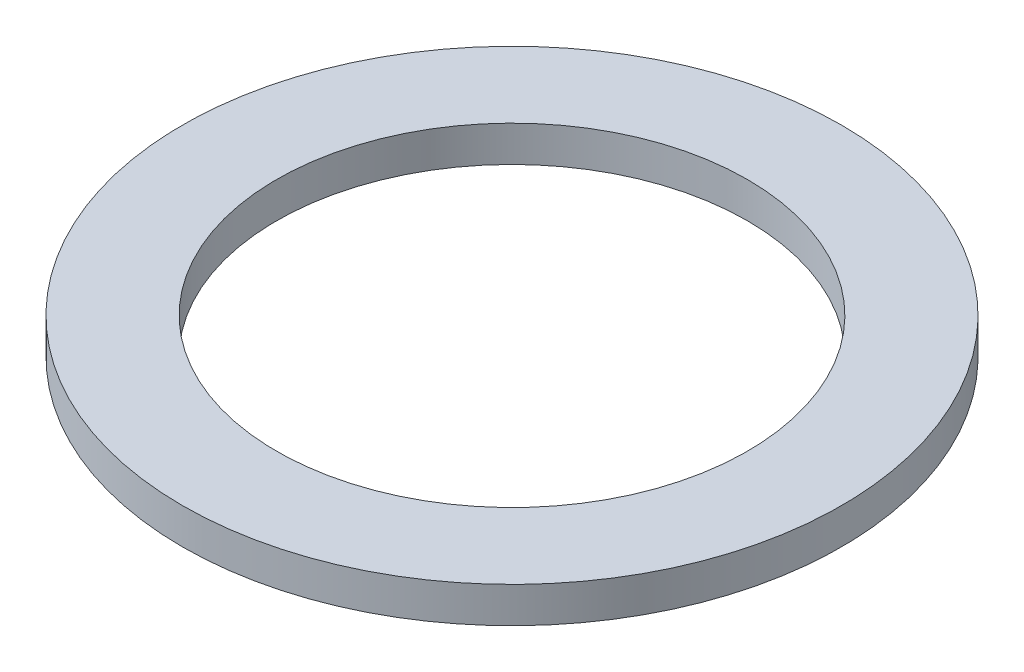
ISO-10303-21;
HEADER;
FILE_DESCRIPTION(('STEP AP214'),'2;1');
FILE_NAME('part.step','',(''),(''),'','','');
FILE_SCHEMA(('AUTOMOTIVE_DESIGN { 1 0 10303 214 1 1 1 1 }'));
ENDSEC;
DATA;
#1=APPLICATION_CONTEXT('core data for automotive mechanical design processes');
#2=APPLICATION_PROTOCOL_DEFINITION('international standard','automotive_design',2000,#1);
#3=PRODUCT_CONTEXT('',#1,'mechanical');
#4=PRODUCT('Part','Part','',(#3));
#5=PRODUCT_RELATED_PRODUCT_CATEGORY('part','',(#4));
#6=PRODUCT_DEFINITION_FORMATION('','',#4);
#7=PRODUCT_DEFINITION_CONTEXT('part definition',#1,'design');
#8=PRODUCT_DEFINITION('design','',#6,#7);
#9=PRODUCT_DEFINITION_SHAPE('','',#8);
#10=(LENGTH_UNIT() NAMED_UNIT(*) SI_UNIT(.MILLI.,.METRE.));
#11=(NAMED_UNIT(*) PLANE_ANGLE_UNIT() SI_UNIT($,.RADIAN.));
#12=(NAMED_UNIT(*) SI_UNIT($,.STERADIAN.) SOLID_ANGLE_UNIT());
#13=UNCERTAINTY_MEASURE_WITH_UNIT(LENGTH_MEASURE(1.E-05),#10,'distance_accuracy_value','');
#14=(GEOMETRIC_REPRESENTATION_CONTEXT(3) GLOBAL_UNCERTAINTY_ASSIGNED_CONTEXT((#13)) GLOBAL_UNIT_ASSIGNED_CONTEXT((#10,
#11,#12)) REPRESENTATION_CONTEXT('',''));
#15=CARTESIAN_POINT('',(0.,0.,0.));
#16=DIRECTION('',(0.,0.,1.));
#17=DIRECTION('',(1.,0.,0.));
#18=AXIS2_PLACEMENT_3D('',#15,#16,#17);
#19=CARTESIAN_POINT('',(0.,0.9652,0.));
#20=DIRECTION('',(0.,1.,0.));
#21=DIRECTION('',(0.,0.,1.));
#22=AXIS2_PLACEMENT_3D('',#19,#20,#21);
#23=PLANE('',#22);
#24=CARTESIAN_POINT('',(0.,0.9652,0.));
#25=DIRECTION('',(0.,1.,0.));
#26=DIRECTION('',(0.,0.,1.));
#27=AXIS2_PLACEMENT_3D('',#24,#25,#26);
#28=CIRCLE('',#27,8.89);
#29=CARTESIAN_POINT('',(0.,0.9652,-8.89));
#30=VERTEX_POINT('',#29);
#31=EDGE_CURVE('E10',#30,#30,#28,.T.);
#32=ORIENTED_EDGE('',*,*,#31,.T.);
#33=EDGE_LOOP('',(#32));
#34=FACE_BOUND('',#33,.T.);
#35=CARTESIAN_POINT('',(0.,0.9652,0.));
#36=DIRECTION('',(0.,1.,0.));
#37=DIRECTION('',(0.,0.,1.));
#38=AXIS2_PLACEMENT_3D('',#35,#36,#37);
#39=CIRCLE('',#38,6.35);
#40=CARTESIAN_POINT('',(0.,0.9652,-6.35));
#41=VERTEX_POINT('',#40);
#42=EDGE_CURVE('E46',#41,#41,#39,.T.);
#43=ORIENTED_EDGE('',*,*,#42,.F.);
#44=EDGE_LOOP('',(#43));
#45=FACE_BOUND('',#44,.T.);
#46=ADVANCED_FACE('F35',(#34,#45),#23,.T.);
#47=CARTESIAN_POINT('',(0.,0.,0.));
#48=DIRECTION('',(0.,1.,0.));
#49=DIRECTION('',(0.,0.,1.));
#50=AXIS2_PLACEMENT_3D('',#47,#48,#49);
#51=PLANE('',#50);
#52=CARTESIAN_POINT('',(0.,0.,0.));
#53=DIRECTION('',(0.,1.,0.));
#54=DIRECTION('',(0.,0.,1.));
#55=AXIS2_PLACEMENT_3D('',#52,#53,#54);
#56=CIRCLE('',#55,8.89);
#57=CARTESIAN_POINT('',(0.,0.,-8.89));
#58=VERTEX_POINT('',#57);
#59=EDGE_CURVE('E39',#58,#58,#56,.T.);
#60=ORIENTED_EDGE('',*,*,#59,.F.);
#61=EDGE_LOOP('',(#60));
#62=FACE_BOUND('',#61,.T.);
#63=CARTESIAN_POINT('',(0.,0.,0.));
#64=DIRECTION('',(0.,1.,0.));
#65=DIRECTION('',(0.,0.,1.));
#66=AXIS2_PLACEMENT_3D('',#63,#64,#65);
#67=CIRCLE('',#66,6.35);
#68=CARTESIAN_POINT('',(0.,0.,-6.35));
#69=VERTEX_POINT('',#68);
#70=EDGE_CURVE('E48',#69,#69,#67,.T.);
#71=ORIENTED_EDGE('',*,*,#70,.T.);
#72=EDGE_LOOP('',(#71));
#73=FACE_BOUND('',#72,.T.);
#74=ADVANCED_FACE('F58',(#62,#73),#51,.F.);
#75=CARTESIAN_POINT('',(0.,0.9652,0.));
#76=DIRECTION('',(0.,-1.,0.));
#77=DIRECTION('',(0.,0.,-1.));
#78=AXIS2_PLACEMENT_3D('',#75,#76,#77);
#79=CYLINDRICAL_SURFACE('',#78,8.89);
#80=CARTESIAN_POINT('',(0.,0.9652,-8.89));
#81=CARTESIAN_POINT('',(0.,0.955145833333333,-8.89));
#82=CARTESIAN_POINT('',(0.,0.945091666666667,-8.89));
#83=CARTESIAN_POINT('',(0.,0.924983333333333,-8.89));
#84=CARTESIAN_POINT('',(0.,0.914929166666667,-8.89));
#85=CARTESIAN_POINT('',(0.,0.894820833333333,-8.89));
#86=CARTESIAN_POINT('',(0.,0.884766666666667,-8.89));
#87=CARTESIAN_POINT('',(0.,0.864658333333333,-8.89));
#88=CARTESIAN_POINT('',(0.,0.854604166666667,-8.89));
#89=CARTESIAN_POINT('',(0.,0.834495833333333,-8.89));
#90=CARTESIAN_POINT('',(0.,0.824441666666667,-8.89));
#91=CARTESIAN_POINT('',(0.,0.804333333333333,-8.89));
#92=CARTESIAN_POINT('',(0.,0.794279166666667,-8.89));
#93=CARTESIAN_POINT('',(0.,0.774170833333333,-8.89));
#94=CARTESIAN_POINT('',(0.,0.764116666666667,-8.89));
#95=CARTESIAN_POINT('',(0.,0.744008333333333,-8.89));
#96=CARTESIAN_POINT('',(0.,0.733954166666667,-8.89));
#97=CARTESIAN_POINT('',(0.,0.713845833333333,-8.89));
#98=CARTESIAN_POINT('',(0.,0.703791666666667,-8.89));
#99=CARTESIAN_POINT('',(0.,0.683683333333333,-8.89));
#100=CARTESIAN_POINT('',(0.,0.673629166666667,-8.89));
#101=CARTESIAN_POINT('',(0.,0.653520833333333,-8.89));
#102=CARTESIAN_POINT('',(0.,0.643466666666667,-8.89));
#103=CARTESIAN_POINT('',(0.,0.623358333333333,-8.89));
#104=CARTESIAN_POINT('',(0.,0.613304166666667,-8.89));
#105=CARTESIAN_POINT('',(0.,0.593195833333333,-8.89));
#106=CARTESIAN_POINT('',(0.,0.583141666666667,-8.89));
#107=CARTESIAN_POINT('',(0.,0.563033333333333,-8.89));
#108=CARTESIAN_POINT('',(0.,0.552979166666667,-8.89));
#109=CARTESIAN_POINT('',(0.,0.532870833333333,-8.89));
#110=CARTESIAN_POINT('',(0.,0.522816666666667,-8.89));
#111=CARTESIAN_POINT('',(0.,0.502708333333333,-8.89));
#112=CARTESIAN_POINT('',(0.,0.492654166666667,-8.89));
#113=CARTESIAN_POINT('',(0.,0.472545833333333,-8.89));
#114=CARTESIAN_POINT('',(0.,0.462491666666667,-8.89));
#115=CARTESIAN_POINT('',(0.,0.442383333333333,-8.89));
#116=CARTESIAN_POINT('',(0.,0.432329166666667,-8.89));
#117=CARTESIAN_POINT('',(0.,0.412220833333333,-8.89));
#118=CARTESIAN_POINT('',(0.,0.402166666666667,-8.89));
#119=CARTESIAN_POINT('',(0.,0.382058333333333,-8.89));
#120=CARTESIAN_POINT('',(0.,0.372004166666667,-8.89));
#121=CARTESIAN_POINT('',(0.,0.351895833333333,-8.89));
#122=CARTESIAN_POINT('',(0.,0.341841666666667,-8.89));
#123=CARTESIAN_POINT('',(0.,0.321733333333333,-8.89));
#124=CARTESIAN_POINT('',(0.,0.311679166666667,-8.89));
#125=CARTESIAN_POINT('',(0.,0.291570833333333,-8.89));
#126=CARTESIAN_POINT('',(0.,0.281516666666667,-8.89));
#127=CARTESIAN_POINT('',(0.,0.261408333333333,-8.89));
#128=CARTESIAN_POINT('',(0.,0.251354166666667,-8.89));
#129=CARTESIAN_POINT('',(0.,0.231245833333333,-8.89));
#130=CARTESIAN_POINT('',(0.,0.221191666666667,-8.89));
#131=CARTESIAN_POINT('',(0.,0.201083333333333,-8.89));
#132=CARTESIAN_POINT('',(0.,0.191029166666667,-8.89));
#133=CARTESIAN_POINT('',(0.,0.170920833333333,-8.89));
#134=CARTESIAN_POINT('',(0.,0.160866666666667,-8.89));
#135=CARTESIAN_POINT('',(0.,0.140758333333333,-8.89));
#136=CARTESIAN_POINT('',(0.,0.130704166666667,-8.89));
#137=CARTESIAN_POINT('',(0.,0.110595833333333,-8.89));
#138=CARTESIAN_POINT('',(0.,0.100541666666667,-8.89));
#139=CARTESIAN_POINT('',(0.,0.0804333333333334,-8.89));
#140=CARTESIAN_POINT('',(0.,0.0703791666666667,-8.89));
#141=CARTESIAN_POINT('',(0.,0.0502708333333333,-8.89));
#142=CARTESIAN_POINT('',(0.,0.0402166666666666,-8.89));
#143=CARTESIAN_POINT('',(0.,0.0201083333333333,-8.89));
#144=CARTESIAN_POINT('',(0.,0.0100541666666667,-8.89));
#145=CARTESIAN_POINT('',(0.,0.,-8.89));
#146=B_SPLINE_CURVE_WITH_KNOTS('',3,(#80,#81,#82,#83,#84,#85,#86,#87,#88,#89,#90,#91,#92,#93,
#94,#95,#96,#97,#98,#99,#100,#101,#102,#103,#104,#105,#106,#107,#108,#109,#110,#111,#112,#113,
#114,#115,#116,#117,#118,#119,#120,#121,#122,#123,#124,#125,#126,#127,#128,#129,#130,#131,#132,
#133,#134,#135,#136,#137,#138,#139,#140,#141,#142,#143,#144,#145),.UNSPECIFIED.,.F.,.F.,(4,2,2,
2,2,2,2,2,2,2,2,2,2,2,2,2,2,2,2,2,2,2,2,2,2,2,2,2,2,2,2,2,4),(0.,0.0301625000000001,
0.0603250000000001,0.0904875000000001,0.12065,0.1508125,0.180975,0.2111375,0.2413,0.2714625,
0.301625,0.3317875,0.36195,0.3921125,0.422275,0.4524375,0.4826,0.5127625,0.542925,0.5730875,
0.60325,0.6334125,0.663575,0.6937375,0.7239,0.7540625,0.784225,0.8143875,0.84455,0.8747125,
0.904875,0.9350375,0.9652),.UNSPECIFIED.);
#147=EDGE_CURVE('BSEAM37',#30,#58,#146,.T.);
#148=ORIENTED_EDGE('',*,*,#31,.F.);
#149=ORIENTED_EDGE('',*,*,#59,.T.);
#150=ORIENTED_EDGE('',*,*,#147,.T.);
#151=ORIENTED_EDGE('',*,*,#147,.F.);
#152=EDGE_LOOP('',(#148,#150,#149,#151));
#153=FACE_BOUND('',#152,.T.);
#154=ADVANCED_FACE('F37',(#153),#79,.T.);
#155=CARTESIAN_POINT('',(0.,0.9652,0.));
#156=DIRECTION('',(0.,-1.,0.));
#157=DIRECTION('',(0.,0.,-1.));
#158=AXIS2_PLACEMENT_3D('',#155,#156,#157);
#159=CYLINDRICAL_SURFACE('',#158,6.35);
#160=CARTESIAN_POINT('',(0.,0.9652,-6.35));
#161=CARTESIAN_POINT('',(0.,0.955145833333333,-6.35));
#162=CARTESIAN_POINT('',(0.,0.945091666666667,-6.35));
#163=CARTESIAN_POINT('',(0.,0.924983333333333,-6.35));
#164=CARTESIAN_POINT('',(0.,0.914929166666667,-6.35));
#165=CARTESIAN_POINT('',(0.,0.894820833333333,-6.35));
#166=CARTESIAN_POINT('',(0.,0.884766666666667,-6.35));
#167=CARTESIAN_POINT('',(0.,0.864658333333333,-6.35));
#168=CARTESIAN_POINT('',(0.,0.854604166666667,-6.35));
#169=CARTESIAN_POINT('',(0.,0.834495833333333,-6.35));
#170=CARTESIAN_POINT('',(0.,0.824441666666667,-6.35));
#171=CARTESIAN_POINT('',(0.,0.804333333333333,-6.35));
#172=CARTESIAN_POINT('',(0.,0.794279166666667,-6.35));
#173=CARTESIAN_POINT('',(0.,0.774170833333333,-6.35));
#174=CARTESIAN_POINT('',(0.,0.764116666666667,-6.35));
#175=CARTESIAN_POINT('',(0.,0.744008333333333,-6.35));
#176=CARTESIAN_POINT('',(0.,0.733954166666667,-6.35));
#177=CARTESIAN_POINT('',(0.,0.713845833333333,-6.35));
#178=CARTESIAN_POINT('',(0.,0.703791666666667,-6.35));
#179=CARTESIAN_POINT('',(0.,0.683683333333333,-6.35));
#180=CARTESIAN_POINT('',(0.,0.673629166666667,-6.35));
#181=CARTESIAN_POINT('',(0.,0.653520833333333,-6.35));
#182=CARTESIAN_POINT('',(0.,0.643466666666667,-6.35));
#183=CARTESIAN_POINT('',(0.,0.623358333333333,-6.35));
#184=CARTESIAN_POINT('',(0.,0.613304166666667,-6.35));
#185=CARTESIAN_POINT('',(0.,0.593195833333333,-6.35));
#186=CARTESIAN_POINT('',(0.,0.583141666666667,-6.35));
#187=CARTESIAN_POINT('',(0.,0.563033333333333,-6.35));
#188=CARTESIAN_POINT('',(0.,0.552979166666667,-6.35));
#189=CARTESIAN_POINT('',(0.,0.532870833333333,-6.35));
#190=CARTESIAN_POINT('',(0.,0.522816666666667,-6.35));
#191=CARTESIAN_POINT('',(0.,0.502708333333333,-6.35));
#192=CARTESIAN_POINT('',(0.,0.492654166666667,-6.35));
#193=CARTESIAN_POINT('',(0.,0.472545833333333,-6.35));
#194=CARTESIAN_POINT('',(0.,0.462491666666667,-6.35));
#195=CARTESIAN_POINT('',(0.,0.442383333333333,-6.35));
#196=CARTESIAN_POINT('',(0.,0.432329166666667,-6.35));
#197=CARTESIAN_POINT('',(0.,0.412220833333333,-6.35));
#198=CARTESIAN_POINT('',(0.,0.402166666666667,-6.35));
#199=CARTESIAN_POINT('',(0.,0.382058333333333,-6.35));
#200=CARTESIAN_POINT('',(0.,0.372004166666667,-6.35));
#201=CARTESIAN_POINT('',(0.,0.351895833333333,-6.35));
#202=CARTESIAN_POINT('',(0.,0.341841666666667,-6.35));
#203=CARTESIAN_POINT('',(0.,0.321733333333333,-6.35));
#204=CARTESIAN_POINT('',(0.,0.311679166666667,-6.35));
#205=CARTESIAN_POINT('',(0.,0.291570833333333,-6.35));
#206=CARTESIAN_POINT('',(0.,0.281516666666667,-6.35));
#207=CARTESIAN_POINT('',(0.,0.261408333333333,-6.35));
#208=CARTESIAN_POINT('',(0.,0.251354166666667,-6.35));
#209=CARTESIAN_POINT('',(0.,0.231245833333333,-6.35));
#210=CARTESIAN_POINT('',(0.,0.221191666666667,-6.35));
#211=CARTESIAN_POINT('',(0.,0.201083333333333,-6.35));
#212=CARTESIAN_POINT('',(0.,0.191029166666667,-6.35));
#213=CARTESIAN_POINT('',(0.,0.170920833333333,-6.35));
#214=CARTESIAN_POINT('',(0.,0.160866666666667,-6.35));
#215=CARTESIAN_POINT('',(0.,0.140758333333333,-6.35));
#216=CARTESIAN_POINT('',(0.,0.130704166666667,-6.35));
#217=CARTESIAN_POINT('',(0.,0.110595833333333,-6.35));
#218=CARTESIAN_POINT('',(0.,0.100541666666667,-6.35));
#219=CARTESIAN_POINT('',(0.,0.0804333333333333,-6.35));
#220=CARTESIAN_POINT('',(0.,0.0703791666666666,-6.35));
#221=CARTESIAN_POINT('',(0.,0.0502708333333333,-6.35));
#222=CARTESIAN_POINT('',(0.,0.0402166666666666,-6.35));
#223=CARTESIAN_POINT('',(0.,0.0201083333333333,-6.35));
#224=CARTESIAN_POINT('',(0.,0.0100541666666667,-6.35));
#225=CARTESIAN_POINT('',(0.,0.,-6.35));
#226=B_SPLINE_CURVE_WITH_KNOTS('',3,(#160,#161,#162,#163,#164,#165,#166,#167,#168,#169,#170,
#171,#172,#173,#174,#175,#176,#177,#178,#179,#180,#181,#182,#183,#184,#185,#186,#187,#188,#189,
#190,#191,#192,#193,#194,#195,#196,#197,#198,#199,#200,#201,#202,#203,#204,#205,#206,#207,#208,
#209,#210,#211,#212,#213,#214,#215,#216,#217,#218,#219,#220,#221,#222,#223,#224,#225),
.UNSPECIFIED.,.F.,.F.,(4,2,2,2,2,2,2,2,2,2,2,2,2,2,2,2,2,2,2,2,2,2,2,2,2,2,2,2,2,2,2,2,4),(0.,
0.0301625,0.060325,0.0904874999999999,0.12065,0.1508125,0.180975,0.2111375,0.2413,0.2714625,
0.301625,0.3317875,0.36195,0.3921125,0.422275,0.4524375,0.4826,0.5127625,0.542925,0.5730875,
0.60325,0.6334125,0.663575,0.6937375,0.7239,0.7540625,0.784225,0.8143875,0.84455,0.8747125,
0.904875,0.9350375,0.9652),.UNSPECIFIED.);
#227=EDGE_CURVE('BSEAM54',#41,#69,#226,.T.);
#228=ORIENTED_EDGE('',*,*,#42,.T.);
#229=ORIENTED_EDGE('',*,*,#70,.F.);
#230=ORIENTED_EDGE('',*,*,#227,.T.);
#231=ORIENTED_EDGE('',*,*,#227,.F.);
#232=EDGE_LOOP('',(#228,#230,#229,#231));
#233=FACE_BOUND('',#232,.T.);
#234=ADVANCED_FACE('F54',(#233),#159,.F.);
#235=CLOSED_SHELL('',(#46,#74,#154,#234));
#236=MANIFOLD_SOLID_BREP('B2',#235);
#237=ADVANCED_BREP_SHAPE_REPRESENTATION('',(#18,#236),#14);
#238=SHAPE_DEFINITION_REPRESENTATION(#9,#237);
ENDSEC;
END-ISO-10303-21;
